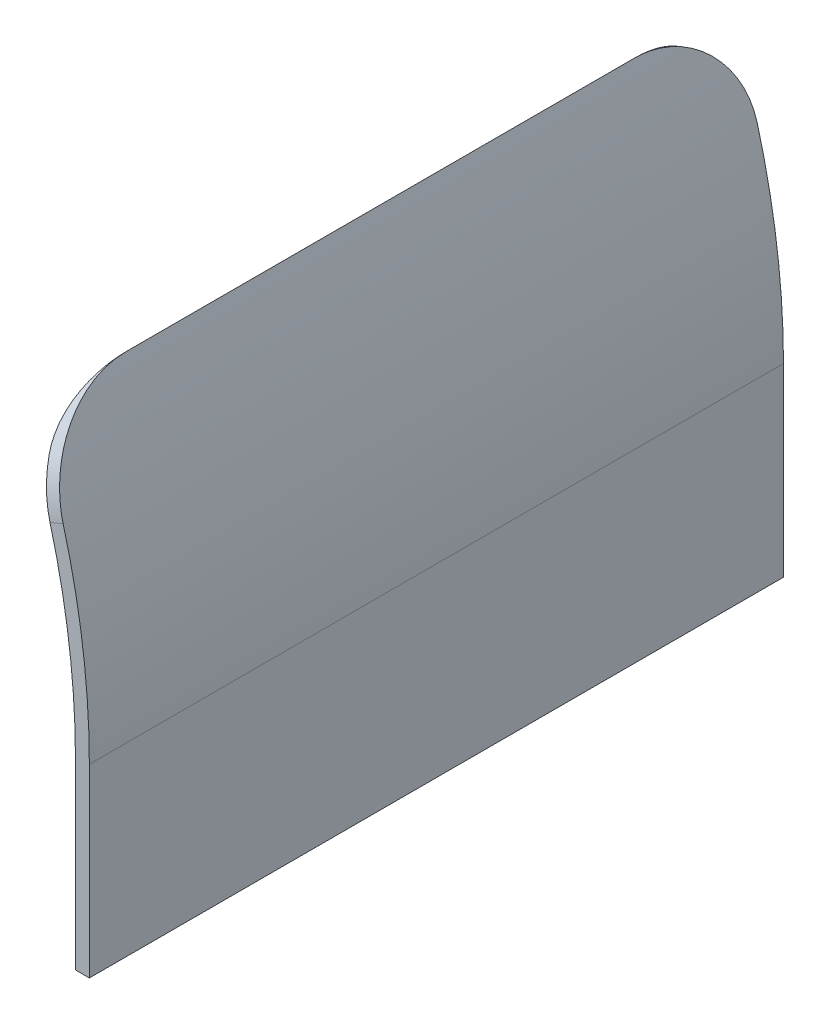
ISO-10303-21;
HEADER;
FILE_DESCRIPTION(('STEP AP214'),'2;1');
FILE_NAME('part.step','',(''),(''),'','','');
FILE_SCHEMA(('AUTOMOTIVE_DESIGN { 1 0 10303 214 1 1 1 1 }'));
ENDSEC;
DATA;
#1=APPLICATION_CONTEXT('core data for automotive mechanical design processes');
#2=APPLICATION_PROTOCOL_DEFINITION('international standard','automotive_design',2000,#1);
#3=PRODUCT_CONTEXT('',#1,'mechanical');
#4=PRODUCT('Part','Part','',(#3));
#5=PRODUCT_RELATED_PRODUCT_CATEGORY('part','',(#4));
#6=PRODUCT_DEFINITION_FORMATION('','',#4);
#7=PRODUCT_DEFINITION_CONTEXT('part definition',#1,'design');
#8=PRODUCT_DEFINITION('design','',#6,#7);
#9=PRODUCT_DEFINITION_SHAPE('','',#8);
#10=(LENGTH_UNIT() NAMED_UNIT(*) SI_UNIT(.MILLI.,.METRE.));
#11=(NAMED_UNIT(*) PLANE_ANGLE_UNIT() SI_UNIT($,.RADIAN.));
#12=(NAMED_UNIT(*) SI_UNIT($,.STERADIAN.) SOLID_ANGLE_UNIT());
#13=UNCERTAINTY_MEASURE_WITH_UNIT(LENGTH_MEASURE(1.E-05),#10,'distance_accuracy_value','');
#14=(GEOMETRIC_REPRESENTATION_CONTEXT(3) GLOBAL_UNCERTAINTY_ASSIGNED_CONTEXT((#13)) GLOBAL_UNIT_ASSIGNED_CONTEXT((#10,
#11,#12)) REPRESENTATION_CONTEXT('',''));
#15=CARTESIAN_POINT('',(0.,0.,0.));
#16=DIRECTION('',(0.,0.,1.));
#17=DIRECTION('',(1.,0.,0.));
#18=AXIS2_PLACEMENT_3D('',#15,#16,#17);
#19=CARTESIAN_POINT('',(0.,0.,375.));
#20=DIRECTION('',(0.,1.,0.));
#21=DIRECTION('',(0.,0.,1.));
#22=AXIS2_PLACEMENT_3D('',#19,#20,#21);
#23=PLANE('',#22);
#24=DIRECTION('',(1.,0.,0.));
#25=VECTOR('',#24,1.);
#26=CARTESIAN_POINT('',(0.,0.,-375.));
#27=LINE('',#26,#25);
#28=CARTESIAN_POINT('',(0.,0.,-375.));
#29=VERTEX_POINT('',#28);
#30=CARTESIAN_POINT('',(15.,0.,-375.));
#31=VERTEX_POINT('',#30);
#32=EDGE_CURVE('E141',#29,#31,#27,.T.);
#33=ORIENTED_EDGE('',*,*,#32,.T.);
#34=DIRECTION('',(0.,0.,-1.));
#35=VECTOR('',#34,1.);
#36=CARTESIAN_POINT('',(15.,0.,375.));
#37=LINE('',#36,#35);
#38=CARTESIAN_POINT('',(15.,0.,375.));
#39=VERTEX_POINT('',#38);
#40=EDGE_CURVE('E119',#39,#31,#37,.T.);
#41=ORIENTED_EDGE('',*,*,#40,.F.);
#42=DIRECTION('',(1.,0.,0.));
#43=VECTOR('',#42,1.);
#44=CARTESIAN_POINT('',(0.,0.,375.));
#45=LINE('',#44,#43);
#46=CARTESIAN_POINT('',(0.,0.,375.));
#47=VERTEX_POINT('',#46);
#48=EDGE_CURVE('E128',#47,#39,#45,.T.);
#49=ORIENTED_EDGE('',*,*,#48,.F.);
#50=DIRECTION('',(0.,0.,-1.));
#51=VECTOR('',#50,1.);
#52=CARTESIAN_POINT('',(0.,0.,375.));
#53=LINE('',#52,#51);
#54=EDGE_CURVE('E226',#47,#29,#53,.T.);
#55=ORIENTED_EDGE('',*,*,#54,.T.);
#56=EDGE_LOOP('',(#33,#41,#49,#55));
#57=FACE_BOUND('',#56,.T.);
#58=ADVANCED_FACE('F45',(#57),#23,.F.);
#59=CARTESIAN_POINT('',(15.,0.,375.));
#60=DIRECTION('',(-1.,0.,0.));
#61=DIRECTION('',(0.,0.,1.));
#62=AXIS2_PLACEMENT_3D('',#59,#60,#61);
#63=PLANE('',#62);
#64=DIRECTION('',(0.,1.,0.));
#65=VECTOR('',#64,1.);
#66=CARTESIAN_POINT('',(15.,0.,-375.));
#67=LINE('',#66,#65);
#68=CARTESIAN_POINT('',(15.,200.,-375.));
#69=VERTEX_POINT('',#68);
#70=EDGE_CURVE('E232',#31,#69,#67,.T.);
#71=ORIENTED_EDGE('',*,*,#70,.T.);
#72=DIRECTION('',(0.,0.,-1.));
#73=VECTOR('',#72,1.);
#74=CARTESIAN_POINT('',(15.,200.,375.));
#75=LINE('',#74,#73);
#76=CARTESIAN_POINT('',(15.,200.,375.));
#77=VERTEX_POINT('',#76);
#78=EDGE_CURVE('E122',#77,#69,#75,.T.);
#79=ORIENTED_EDGE('',*,*,#78,.F.);
#80=DIRECTION('',(0.,1.,0.));
#81=VECTOR('',#80,1.);
#82=CARTESIAN_POINT('',(15.,0.,375.));
#83=LINE('',#82,#81);
#84=EDGE_CURVE('E115',#39,#77,#83,.T.);
#85=ORIENTED_EDGE('',*,*,#84,.F.);
#86=ORIENTED_EDGE('',*,*,#40,.T.);
#87=EDGE_LOOP('',(#71,#79,#85,#86));
#88=FACE_BOUND('',#87,.T.);
#89=ADVANCED_FACE('F117',(#88),#63,.F.);
#90=CARTESIAN_POINT('',(-785.,200.,375.));
#91=DIRECTION('',(0.,0.,-1.));
#92=DIRECTION('',(-1.,0.,0.));
#93=AXIS2_PLACEMENT_3D('',#90,#91,#92);
#94=CYLINDRICAL_SURFACE('',#93,800.);
#95=CARTESIAN_POINT('',(-785.,200.,-375.));
#96=DIRECTION('',(0.,0.,1.));
#97=DIRECTION('',(1.,0.,0.));
#98=AXIS2_PLACEMENT_3D('',#95,#96,#97);
#99=CIRCLE('',#98,800.);
#100=CARTESIAN_POINT('',(-13.2877173778747,410.855763141891,-375.));
#101=VERTEX_POINT('',#100);
#102=EDGE_CURVE('E235',#69,#101,#99,.T.);
#103=ORIENTED_EDGE('',*,*,#102,.T.);
#104=CARTESIAN_POINT('',(-13.2877173778747,410.855763141891,-375.));
#105=CARTESIAN_POINT('',(-13.6577250364129,412.209991403564,-375.000018910547));
#106=CARTESIAN_POINT('',(-14.0313157060757,413.56324410264,-374.970845063242));
#107=CARTESIAN_POINT('',(-14.7849490421952,416.265435949646,-374.854137478364));
#108=CARTESIAN_POINT('',(-15.1649917394234,417.614375076968,-374.766603462378));
#109=CARTESIAN_POINT('',(-15.9308105996656,420.305561009249,-374.533201458944));
#110=CARTESIAN_POINT('',(-16.3165867482794,421.647807831004,-374.387333617982));
#111=CARTESIAN_POINT('',(-17.0930926189071,424.323252370832,-374.037426181503));
#112=CARTESIAN_POINT('',(-17.483822325785,425.656450116536,-373.833386763692));
#113=CARTESIAN_POINT('',(-18.2691275183212,428.310497015986,-373.367568541861));
#114=CARTESIAN_POINT('',(-18.6637000066751,429.63135443052,-373.1058317553));
#115=CARTESIAN_POINT('',(-19.4561387690343,432.259511085844,-372.524881563681));
#116=CARTESIAN_POINT('',(-19.8540053453659,433.566809056799,-372.205662825961));
#117=CARTESIAN_POINT('',(-20.652038544135,436.165282908035,-371.510291521042));
#118=CARTESIAN_POINT('',(-21.0522048867897,437.456460691258,-371.134145744039));
#119=CARTESIAN_POINT('',(-21.853973866843,440.020723173256,-370.325450196681));
#120=CARTESIAN_POINT('',(-22.2555766350668,441.293806168638,-369.892895154605));
#121=CARTESIAN_POINT('',(-23.0594460667762,443.820324734611,-368.971829629249));
#122=CARTESIAN_POINT('',(-23.4617129870541,445.073747691189,-368.483284768101));
#123=CARTESIAN_POINT('',(-24.2656850583927,447.558087799104,-367.451222516608));
#124=CARTESIAN_POINT('',(-24.6673901531011,448.789002824124,-366.907699963895));
#125=CARTESIAN_POINT('',(-25.4691268265985,451.225989932504,-365.766688615531));
#126=CARTESIAN_POINT('',(-25.8691585336861,452.432063949313,-365.169204039546));
#127=CARTESIAN_POINT('',(-26.666553472084,454.817514327678,-363.921202269231));
#128=CARTESIAN_POINT('',(-27.0639164489499,455.996888168281,-363.270680093706));
#129=CARTESIAN_POINT('',(-27.854720750262,458.326418802984,-361.91801214104));
#130=CARTESIAN_POINT('',(-28.2481633556597,459.476585344162,-361.215883898814));
#131=CARTESIAN_POINT('',(-29.0302076910797,461.746278023337,-359.760971456919));
#132=CARTESIAN_POINT('',(-29.4188089630018,462.865801273601,-359.008182506097));
#133=CARTESIAN_POINT('',(-30.1900106580296,465.072151741258,-357.453379544622));
#134=CARTESIAN_POINT('',(-30.5726114309345,466.158980867974,-356.65136841687));
#135=CARTESIAN_POINT('',(-31.330736110453,468.298208103351,-354.999495475144));
#136=CARTESIAN_POINT('',(-31.7062599772519,469.350606018327,-354.149633392069));
#137=CARTESIAN_POINT('',(-32.4478856676362,471.415760294156,-352.406495968416));
#138=CARTESIAN_POINT('',(-32.8140148363094,472.428637622726,-351.513375568254));
#139=CARTESIAN_POINT('',(-33.5370706269137,474.416808378586,-349.682684379559));
#140=CARTESIAN_POINT('',(-33.8939972539362,475.39210182667,-348.745113615618));
#141=CARTESIAN_POINT('',(-34.5975835521476,477.303535110928,-346.8271738585));
#142=CARTESIAN_POINT('',(-34.9442431644635,478.239674722599,-345.846804619988));
#143=CARTESIAN_POINT('',(-35.6262427362653,480.071289031497,-343.845012830625));
#144=CARTESIAN_POINT('',(-35.9615827571005,480.966763949125,-342.823590502338));
#145=CARTESIAN_POINT('',(-36.6200096905904,482.715870810004,-340.741207982379));
#146=CARTESIAN_POINT('',(-36.9430932030172,483.569491160803,-339.680236978548));
#147=CARTESIAN_POINT('',(-37.5758807059166,485.233199235097,-337.520999980803));
#148=CARTESIAN_POINT('',(-37.8855859308919,486.043290976955,-336.422737444802));
#149=CARTESIAN_POINT('',(-38.4907053685442,487.61881933515,-334.19067742813));
#150=CARTESIAN_POINT('',(-38.7861184350095,488.384252370931,-333.056877109352));
#151=CARTESIAN_POINT('',(-39.3616689478563,489.869131284853,-330.755936474801));
#152=CARTESIAN_POINT('',(-39.6418078052782,490.588581411984,-329.588799253942));
#153=CARTESIAN_POINT('',(-40.1866362067176,491.982215768945,-327.220157790107));
#154=CARTESIAN_POINT('',(-40.4512849449763,492.656281085914,-326.01857419444));
#155=CARTESIAN_POINT('',(-40.9634882268658,493.956046153262,-323.586114290732));
#156=CARTESIAN_POINT('',(-41.2110443532076,494.581750382336,-322.355240709063));
#157=CARTESIAN_POINT('',(-41.6883230524377,495.783990948865,-319.866085730181));
#158=CARTESIAN_POINT('',(-41.9180429041101,496.360519785126,-318.607800188178));
#159=CARTESIAN_POINT('',(-42.3588366618777,497.463367750415,-316.066351517486));
#160=CARTESIAN_POINT('',(-42.5699123033419,497.989691552801,-314.783190717727));
#161=CARTESIAN_POINT('',(-42.9726733950597,498.991200205916,-312.194632490098));
#162=CARTESIAN_POINT('',(-43.1643660432165,499.466404044337,-310.889243528657));
#163=CARTESIAN_POINT('',(-43.5278012978003,500.365133616457,-308.258196684566));
#164=CARTESIAN_POINT('',(-43.699545727717,500.788664073858,-306.932540667106));
#165=CARTESIAN_POINT('',(-44.022511479144,501.583397288082,-304.2633785274));
#166=CARTESIAN_POINT('',(-44.1737359073913,501.954607966472,-302.919875141144));
#167=CARTESIAN_POINT('',(-44.4551782220812,502.644189540433,-300.217322185389));
#168=CARTESIAN_POINT('',(-44.5853973780436,502.962563629384,-298.858273560734));
#169=CARTESIAN_POINT('',(-44.8662171724185,503.648094836885,-295.649051381414));
#170=CARTESIAN_POINT('',(-45.0080135537683,503.993359799862,-293.793376080484));
#171=CARTESIAN_POINT('',(-45.2516518399048,504.585757603332,-290.064310802836));
#172=CARTESIAN_POINT('',(-45.3535019133158,504.832910506894,-288.190924528163));
#173=CARTESIAN_POINT('',(-45.5165637901925,505.228264677415,-284.434417668778));
#174=CARTESIAN_POINT('',(-45.5778303007431,505.376599154234,-282.551313651008));
#175=CARTESIAN_POINT('',(-45.6391370625472,505.524985511469,-279.722134206108));
#176=CARTESIAN_POINT('',(-45.6544738205396,505.562095075348,-278.778175618525));
#177=CARTESIAN_POINT('',(-45.6749271062528,505.6115786349,-276.889495550157));
#178=CARTESIAN_POINT('',(-45.6800435893792,505.623952522644,-275.944774066062));
#179=CARTESIAN_POINT('',(-45.6800427553632,505.623953282115,-275.));
#180=B_SPLINE_CURVE_WITH_KNOTS('',3,(#104,#105,#106,#107,#108,#109,#110,#111,#112,#113,#114,
#115,#116,#117,#118,#119,#120,#121,#122,#123,#124,#125,#126,#127,#128,#129,#130,#131,#132,#133,
#134,#135,#136,#137,#138,#139,#140,#141,#142,#143,#144,#145,#146,#147,#148,#149,#150,#151,#152,
#153,#154,#155,#156,#157,#158,#159,#160,#161,#162,#163,#164,#165,#166,#167,#168,#169,#170,#171,
#172,#173,#174,#175,#176,#177,#178,#179),.UNSPECIFIED.,.F.,.F.,(4,2,2,2,2,2,2,2,2,2,2,2,2,2,2,2,
2,2,2,2,2,2,2,2,2,2,2,2,2,2,2,2,2,2,2,2,2,4),(0.,4.21129501087643,8.42261011229035,
12.6339146383732,16.8452062995758,21.0534412072571,25.2620667187199,29.4701906248927,
33.6787080829309,37.8898235652793,42.1013348363465,46.3125170648926,50.5240952567557,
54.7342489791156,58.9447980974444,63.1551008423969,67.3654272674023,71.5616518059008,
75.7578740227314,79.9541202968626,84.1503438247508,88.3477230896977,92.5447142037582,
96.7420413547272,100.938980094841,105.146518639281,109.353667057688,113.561456089396,
117.768853054156,121.974681813024,126.180125809172,130.384932387199,134.589484739198,
140.26479417052,145.938942451439,151.605426268342,154.439536132392,157.273658362556),.UNSPECIFIED.);
#181=CARTESIAN_POINT('',(-45.6800427553632,505.623953282115,-275.));
#182=VERTEX_POINT('',#181);
#183=EDGE_CURVE('E189',#101,#182,#180,.T.);
#184=ORIENTED_EDGE('',*,*,#183,.T.);
#185=DIRECTION('',(0.,0.,-1.));
#186=VECTOR('',#185,1.);
#187=CARTESIAN_POINT('',(-45.6800427553632,505.623953282115,375.));
#188=LINE('',#187,#186);
#189=CARTESIAN_POINT('',(-45.6800427553632,505.623953282115,275.));
#190=VERTEX_POINT('',#189);
#191=EDGE_CURVE('E149',#190,#182,#188,.T.);
#192=ORIENTED_EDGE('',*,*,#191,.F.);
#193=CARTESIAN_POINT('',(-45.6800427553632,505.623953282115,275.));
#194=CARTESIAN_POINT('',(-45.6800565541126,505.623968136574,276.406191723882));
#195=CARTESIAN_POINT('',(-45.6687116734357,505.596542171494,277.812382063271));
#196=CARTESIAN_POINT('',(-45.6234037466712,505.486915370362,280.622257287123));
#197=CARTESIAN_POINT('',(-45.5894407637724,505.404714687336,282.025942178576));
#198=CARTESIAN_POINT('',(-45.4989979226887,505.185650298247,284.828246709429));
#199=CARTESIAN_POINT('',(-45.4425191090568,505.04878912799,286.226866580769));
#200=CARTESIAN_POINT('',(-45.3072405788958,504.720615267442,289.016617183136));
#201=CARTESIAN_POINT('',(-45.2284408831475,504.529302627845,290.407747921134));
#202=CARTESIAN_POINT('',(-45.0488566423127,504.092684965104,293.17895968944));
#203=CARTESIAN_POINT('',(-44.9480893772322,503.847422378406,294.559048525826));
#204=CARTESIAN_POINT('',(-44.7248638370595,503.303164012407,297.306955847708));
#205=CARTESIAN_POINT('',(-44.6024035376501,503.00416321841,298.674773175543));
#206=CARTESIAN_POINT('',(-44.3362240604119,502.352930719918,301.395433195122));
#207=CARTESIAN_POINT('',(-44.1925071256558,502.000704631853,302.748277450704));
#208=CARTESIAN_POINT('',(-43.8842718630225,501.243497186474,305.436860691937));
#209=CARTESIAN_POINT('',(-43.719751590567,500.838510897329,306.772598065662));
#210=CARTESIAN_POINT('',(-43.3704003826977,499.976254754565,309.424986880827));
#211=CARTESIAN_POINT('',(-43.1855614834199,499.518964397558,310.741630608025));
#212=CARTESIAN_POINT('',(-42.796221855903,498.552881302659,313.35307556464));
#213=CARTESIAN_POINT('',(-42.5917192886936,498.044083747515,314.647874737791));
#214=CARTESIAN_POINT('',(-42.1637608101866,496.975845417642,317.213093748428));
#215=CARTESIAN_POINT('',(-41.9403064743756,496.416408852345,318.483515601689));
#216=CARTESIAN_POINT('',(-41.4751424445394,495.247661788293,320.997947167346));
#217=CARTESIAN_POINT('',(-41.2334310452227,494.638346630208,322.24195439856));
#218=CARTESIAN_POINT('',(-40.7326268193662,493.370996027709,324.700893874265));
#219=CARTESIAN_POINT('',(-40.4735385986909,492.712973488817,325.915833708372));
#220=CARTESIAN_POINT('',(-39.9387387174717,491.349023588189,328.314926339061));
#221=CARTESIAN_POINT('',(-39.6630255099536,490.643091767668,329.499076255888));
#222=CARTESIAN_POINT('',(-39.0959002503427,489.184519251853,331.834296450633));
#223=CARTESIAN_POINT('',(-38.8044890626513,488.431881128072,332.985368544624));
#224=CARTESIAN_POINT('',(-38.2068822167709,486.881037648357,335.252454333706));
#225=CARTESIAN_POINT('',(-37.9006864780317,486.082832044155,336.368467837736));
#226=CARTESIAN_POINT('',(-37.2746446325914,484.442548004809,338.562862819675));
#227=CARTESIAN_POINT('',(-36.9548057646562,483.600492784273,339.641263715291));
#228=CARTESIAN_POINT('',(-36.3023289802627,481.873463563861,341.759124036995));
#229=CARTESIAN_POINT('',(-35.9696910659202,480.98848957108,342.798583469519));
#230=CARTESIAN_POINT('',(-35.2926436352677,479.177031158951,344.836714810108));
#231=CARTESIAN_POINT('',(-34.9482340205645,478.250546392616,345.835386377095));
#232=CARTESIAN_POINT('',(-34.2487029097248,476.357572805596,347.790144790076));
#233=CARTESIAN_POINT('',(-33.8935814784842,475.391084227255,348.746231893973));
#234=CARTESIAN_POINT('',(-33.1736301014543,473.419478257059,350.614302332748));
#235=CARTESIAN_POINT('',(-32.808798298854,472.41435346065,351.526277137196));
#236=CARTESIAN_POINT('',(-32.0706166473373,470.367393144097,353.30421659345));
#237=CARTESIAN_POINT('',(-31.6972676016474,469.32556108066,354.170185558448));
#238=CARTESIAN_POINT('',(-30.9430889152035,467.206735429492,355.854729595181));
#239=CARTESIAN_POINT('',(-30.5622586988088,466.129739131783,356.673301000616));
#240=CARTESIAN_POINT('',(-29.7942865454567,463.942557364827,358.261449464839));
#241=CARTESIAN_POINT('',(-29.4071452090701,462.8323750453,359.03103115173));
#242=CARTESIAN_POINT('',(-28.6286101941622,460.583447289337,360.51803202393));
#243=CARTESIAN_POINT('',(-28.2372298185475,459.444781589188,361.235578770137));
#244=CARTESIAN_POINT('',(-27.4503800131302,457.138207854641,362.619336102565));
#245=CARTESIAN_POINT('',(-27.0549109724903,455.970302588516,363.285551524441));
#246=CARTESIAN_POINT('',(-26.2608673046273,453.60694531105,364.56565990955));
#247=CARTESIAN_POINT('',(-25.8622922194976,452.411489185173,365.179544992423));
#248=CARTESIAN_POINT('',(-25.0631972835159,449.995349500728,366.353768895549));
#249=CARTESIAN_POINT('',(-24.6626776180342,448.774668312011,366.914112718343));
#250=CARTESIAN_POINT('',(-23.8608281308054,446.310453097825,367.98019655822));
#251=CARTESIAN_POINT('',(-23.4594986072885,445.066926465181,368.485953887663));
#252=CARTESIAN_POINT('',(-22.656958706531,442.558901737374,369.442178324547));
#253=CARTESIAN_POINT('',(-22.2557483217298,441.294405580245,369.892650509551));
#254=CARTESIAN_POINT('',(-21.4544576967176,438.746701813586,370.737556925593));
#255=CARTESIAN_POINT('',(-21.0543772919095,437.463497116934,371.131999779674));
#256=CARTESIAN_POINT('',(-20.2562761088273,434.88053173691,371.86427172738));
#257=CARTESIAN_POINT('',(-19.8582552055937,433.580772074967,372.202104295788));
#258=CARTESIAN_POINT('',(-18.9308858860504,430.524300674351,372.925385386806));
#259=CARTESIAN_POINT('',(-18.4026893500461,428.76184038977,373.288242146161));
#260=CARTESIAN_POINT('',(-17.3537961308515,425.217055767186,373.91061561424));
#261=CARTESIAN_POINT('',(-16.8330979433524,423.434735544398,374.170153337105));
#262=CARTESIAN_POINT('',(-15.8017365438328,419.857885506434,374.585125350851));
#263=CARTESIAN_POINT('',(-15.2910597047027,418.063377492564,374.740712123541));
#264=CARTESIAN_POINT('',(-14.5333480070523,415.364835181181,374.896293590036));
#265=CARTESIAN_POINT('',(-14.2821254166676,414.464059461957,374.935187626041));
#266=CARTESIAN_POINT('',(-13.7826499346412,412.660937450646,374.987040678364));
#267=CARTESIAN_POINT('',(-13.5343970489941,411.758591155393,374.999999642339));
#268=CARTESIAN_POINT('',(-13.2877173778748,410.855763141891,375.));
#269=B_SPLINE_CURVE_WITH_KNOTS('',3,(#193,#194,#195,#196,#197,#198,#199,#200,#201,#202,#203,
#204,#205,#206,#207,#208,#209,#210,#211,#212,#213,#214,#215,#216,#217,#218,#219,#220,#221,#222,
#223,#224,#225,#226,#227,#228,#229,#230,#231,#232,#233,#234,#235,#236,#237,#238,#239,#240,#241,
#242,#243,#244,#245,#246,#247,#248,#249,#250,#251,#252,#253,#254,#255,#256,#257,#258,#259,#260,
#261,#262,#263,#264,#265,#266,#267,#268),.UNSPECIFIED.,.F.,.F.,(4,2,2,2,2,2,2,2,2,2,2,2,2,2,2,2,
2,2,2,2,2,2,2,2,2,2,2,2,2,2,2,2,2,2,2,2,2,4),(0.,4.21826002803209,8.43650827143591,
12.654560844884,16.8726094913362,21.0873520558621,25.30248813263,29.5171797307678,
33.7322655860591,37.9490094704454,42.1661480941563,46.3829364843149,50.6001192296471,
54.8161885613488,59.0326508103981,63.2488811189141,67.4651344011647,71.6791777936155,
75.8932204894601,80.1072984168306,84.3213508189953,88.5362149023579,92.7506831289345,
96.9654769190217,101.179871940857,105.383559501479,109.586850569131,113.790773490943,
117.994303241226,122.196495880565,126.398302287858,130.599461325182,134.800362397616,
140.423271914824,146.045037198864,151.658537911287,154.466105454338,157.27367866377),.UNSPECIFIED.);
#270=CARTESIAN_POINT('',(-13.2877173778747,410.855763141891,375.));
#271=VERTEX_POINT('',#270);
#272=EDGE_CURVE('E183',#190,#271,#269,.T.);
#273=ORIENTED_EDGE('',*,*,#272,.T.);
#274=CARTESIAN_POINT('',(-785.,200.,375.));
#275=DIRECTION('',(0.,0.,1.));
#276=DIRECTION('',(1.,0.,0.));
#277=AXIS2_PLACEMENT_3D('',#274,#275,#276);
#278=CIRCLE('',#277,800.);
#279=EDGE_CURVE('E127',#77,#271,#278,.T.);
#280=ORIENTED_EDGE('',*,*,#279,.F.);
#281=ORIENTED_EDGE('',*,*,#78,.T.);
#282=EDGE_LOOP('',(#103,#184,#192,#273,#280,#281));
#283=FACE_BOUND('',#282,.T.);
#284=ADVANCED_FACE('F172',(#283),#94,.T.);
#285=CARTESIAN_POINT('',(-800.,197.036521770616,375.));
#286=DIRECTION('',(0.,0.,-1.));
#287=DIRECTION('',(-1.,0.,0.));
#288=AXIS2_PLACEMENT_3D('',#285,#286,#287);
#289=CYLINDRICAL_SURFACE('',#288,800.);
#290=CARTESIAN_POINT('',(-27.5291433547764,405.096070058586,375.));
#291=CARTESIAN_POINT('',(-27.8944080499808,406.452238113832,375.000018864326));
#292=CARTESIAN_POINT('',(-28.2632625196973,407.807442886582,374.970844222511));
#293=CARTESIAN_POINT('',(-29.0074457271469,410.513561600564,374.854129730451));
#294=CARTESIAN_POINT('',(-29.3827744977664,411.86447551996,374.766589583651));
#295=CARTESIAN_POINT('',(-30.1391973411387,414.559634578344,374.533165872968));
#296=CARTESIAN_POINT('',(-30.5202914145217,415.903879716604,374.387282302707));
#297=CARTESIAN_POINT('',(-31.2874723879068,418.583337644585,374.037329945425));
#298=CARTESIAN_POINT('',(-31.6735592722719,419.918550462574,373.833261340592));
#299=CARTESIAN_POINT('',(-32.4496367206329,422.576663487066,373.367362969953));
#300=CARTESIAN_POINT('',(-32.8396243292035,423.899571737127,373.10557417641));
#301=CARTESIAN_POINT('',(-33.6229482746934,426.531838414553,372.5244963289));
#302=CARTESIAN_POINT('',(-34.0162849189537,427.841195573365,372.205201942258));
#303=CARTESIAN_POINT('',(-34.8053214821172,430.443789839257,371.509652047639));
#304=CARTESIAN_POINT('',(-35.2010211122097,431.737028859017,371.133403369234));
#305=CARTESIAN_POINT('',(-35.9939263980552,434.305411446323,370.324470924192));
#306=CARTESIAN_POINT('',(-36.3911321911759,435.580553310467,369.891781883636));
#307=CARTESIAN_POINT('',(-37.1862875265758,438.111199629397,368.970407478489));
#308=CARTESIAN_POINT('',(-37.5842373800425,439.36669118233,368.481686944835));
#309=CARTESIAN_POINT('',(-38.3796585941867,441.855152650938,367.449234399811));
#310=CARTESIAN_POINT('',(-38.7771299063686,443.088120438438,366.905497221568));
#311=CARTESIAN_POINT('',(-39.5704892851061,445.529190059509,365.764015113545));
#312=CARTESIAN_POINT('',(-39.9663774725522,446.737293822131,365.16627439312));
#313=CARTESIAN_POINT('',(-40.7555806268171,449.126773352053,363.917716946776));
#314=CARTESIAN_POINT('',(-41.1488953481018,450.308146594687,363.26689523393));
#315=CARTESIAN_POINT('',(-41.9317028342381,452.641628964536,361.913588348547));
#316=CARTESIAN_POINT('',(-42.3211968718061,453.793748054915,361.211121091396));
#317=CARTESIAN_POINT('',(-43.0954499601692,456.0673006845,359.755485731095));
#318=CARTESIAN_POINT('',(-43.4802085625001,457.188731329508,359.002312868967));
#319=CARTESIAN_POINT('',(-44.2438360991337,459.398843019743,357.446697293732));
#320=CARTESIAN_POINT('',(-44.6227053784893,460.487525987163,356.644257480892));
#321=CARTESIAN_POINT('',(-45.3734826418425,462.630400155604,354.9914825215));
#322=CARTESIAN_POINT('',(-45.7453905870614,463.684591164508,354.141147108245));
#323=CARTESIAN_POINT('',(-46.4797892237149,465.752899851111,352.397322518011));
#324=CARTESIAN_POINT('',(-46.8423096308784,466.76715119063,351.504004378964));
#325=CARTESIAN_POINT('',(-47.5582776104594,468.758021629609,349.672906029109));
#326=CARTESIAN_POINT('',(-47.911725188495,469.734640752372,348.735125845833));
#327=CARTESIAN_POINT('',(-48.6084879191436,471.648671654857,346.816755872696));
#328=CARTESIAN_POINT('',(-48.9518030150475,472.586083215156,345.836165843314));
#329=CARTESIAN_POINT('',(-49.6272528302337,474.420182744078,343.833921551857));
#330=CARTESIAN_POINT('',(-49.9593876102622,475.316870933973,342.812267512962));
#331=CARTESIAN_POINT('',(-50.6115472044263,477.068341991785,340.729410545467));
#332=CARTESIAN_POINT('',(-50.931568647167,477.923113212614,339.668196767329));
#333=CARTESIAN_POINT('',(-51.5583803180836,479.589054857527,337.508465346835));
#334=CARTESIAN_POINT('',(-51.8651717677338,480.400229308443,336.409951165093));
#335=CARTESIAN_POINT('',(-52.4646155224985,481.977850998155,334.177380348448));
#336=CARTESIAN_POINT('',(-52.7572666943193,482.744294652954,333.043320876684));
#337=CARTESIAN_POINT('',(-53.3274497125886,484.231118796949,330.741856031252));
#338=CARTESIAN_POINT('',(-53.6049829565901,484.951503545061,329.574453755167));
#339=CARTESIAN_POINT('',(-54.1446901551494,486.346766320318,327.205555427822));
#340=CARTESIAN_POINT('',(-54.4068274730387,487.021536334405,326.003987409127));
#341=CARTESIAN_POINT('',(-54.9141804697008,488.322651027979,323.571569438831));
#342=CARTESIAN_POINT('',(-55.1593977158377,488.949000193504,322.340722213705));
#343=CARTESIAN_POINT('',(-55.6321745710926,490.152469006203,319.851631118287));
#344=CARTESIAN_POINT('',(-55.8597314880372,490.72958114892,318.593383108261));
#345=CARTESIAN_POINT('',(-56.2963796799783,491.833532372526,316.052020682651));
#346=CARTESIAN_POINT('',(-56.5054726731874,492.360376131649,314.768908594445));
#347=CARTESIAN_POINT('',(-56.9044526499678,493.362859560579,312.180459778563));
#348=CARTESIAN_POINT('',(-57.0943467731427,493.838518269157,310.875131525101));
#349=CARTESIAN_POINT('',(-57.4543718511377,494.738091837689,308.244217412527));
#350=CARTESIAN_POINT('',(-57.6245046121883,495.162011426889,306.918633417385));
#351=CARTESIAN_POINT('',(-57.9444368796891,495.95745621966,304.24962669513));
#352=CARTESIAN_POINT('',(-58.0942394664281,496.3289893608,302.906206704343));
#353=CARTESIAN_POINT('',(-58.3730304603566,497.019148608302,300.203831481335));
#354=CARTESIAN_POINT('',(-58.5020201264416,497.337777914654,298.844877194055));
#355=CARTESIAN_POINT('',(-58.7801002816492,498.023634127939,295.636802151434));
#356=CARTESIAN_POINT('',(-58.9204856005801,498.368989148268,293.782196171514));
#357=CARTESIAN_POINT('',(-59.1617011092964,498.961540590617,290.055302231313));
#358=CARTESIAN_POINT('',(-59.2625393902284,499.208757091465,288.18301796829));
#359=CARTESIAN_POINT('',(-59.4239817694667,499.604211876589,284.428741634823));
#360=CARTESIAN_POINT('',(-59.4846401478106,499.752583694186,282.546766136735));
#361=CARTESIAN_POINT('',(-59.5453384769164,499.901007371348,279.719287581505));
#362=CARTESIAN_POINT('',(-59.5605230515783,499.938126259991,278.775897452482));
#363=CARTESIAN_POINT('',(-59.5807733972704,499.987622249043,276.888355712428));
#364=CARTESIAN_POINT('',(-59.5858391242069,499.999999241636,275.944204098098));
#365=CARTESIAN_POINT('',(-59.5858382910593,500.,275.));
#366=B_SPLINE_CURVE_WITH_KNOTS('',3,(#290,#291,#292,#293,#294,#295,#296,#297,#298,#299,#300,
#301,#302,#303,#304,#305,#306,#307,#308,#309,#310,#311,#312,#313,#314,#315,#316,#317,#318,#319,
#320,#321,#322,#323,#324,#325,#326,#327,#328,#329,#330,#331,#332,#333,#334,#335,#336,#337,#338,
#339,#340,#341,#342,#343,#344,#345,#346,#347,#348,#349,#350,#351,#352,#353,#354,#355,#356,#357,
#358,#359,#360,#361,#362,#363,#364,#365),.UNSPECIFIED.,.F.,.F.,(4,2,2,2,2,2,2,2,2,2,2,2,2,2,2,2,
2,2,2,2,2,2,2,2,2,2,2,2,2,2,2,2,2,2,2,2,2,4),(0.,4.21318640938884,8.42639422615339,
12.6396025035198,16.8527975886159,21.063011541022,25.2736161210304,29.4837161933075,
33.6942099494016,37.9073611089245,42.1209083133454,46.3341273719234,50.5477427168583,
54.7599032303009,58.9724596289394,63.1847682783775,67.3971003860176,71.5938700459787,
75.7906371071508,79.9874276522001,84.1841953911213,88.3821227159389,92.5796616288605,
96.7775364037008,100.975022451782,105.182122884141,109.388833073722,113.5961832875,
117.803141560896,122.008529567135,126.213532888965,130.417898384489,134.622009478263,
140.293913505966,145.964656481417,151.627722998897,154.460123354176,157.292536051877),.UNSPECIFIED.);
#367=CARTESIAN_POINT('',(-27.5291433547764,405.096070058586,375.));
#368=VERTEX_POINT('',#367);
#369=CARTESIAN_POINT('',(-42.3413588034726,453.850429922475,361.164336657928));
#370=VERTEX_POINT('',#369);
#371=EDGE_CURVE('E143',#368,#370,#366,.T.);
#372=ORIENTED_EDGE('',*,*,#371,.T.);
#373=DIRECTION('',(0.,0.,-1.));
#374=VECTOR('',#373,1.);
#375=CARTESIAN_POINT('',(-42.3413588034725,453.850429922475,375.));
#376=LINE('',#375,#374);
#377=CARTESIAN_POINT('',(-42.3413588034726,453.850429922475,-361.164336657928));
#378=VERTEX_POINT('',#377);
#379=EDGE_CURVE('E211',#370,#378,#376,.T.);
#380=ORIENTED_EDGE('',*,*,#379,.T.);
#381=CARTESIAN_POINT('',(-59.5858382910594,500.,-275.));
#382=CARTESIAN_POINT('',(-59.5858520234534,500.000014875716,-276.406144996598));
#383=CARTESIAN_POINT('',(-59.5746068324503,499.972550724524,-277.812288617039));
#384=CARTESIAN_POINT('',(-59.5296973187888,499.862771286295,-280.622070792378));
#385=CARTESIAN_POINT('',(-59.4960330581189,499.78045615092,-282.025709354191));
#386=CARTESIAN_POINT('',(-59.4063861790104,499.561086701523,-284.827922517796));
#387=CARTESIAN_POINT('',(-59.3504045862108,499.424034903037,-286.22649734932));
#388=CARTESIAN_POINT('',(-59.2163180755653,499.095403941317,-289.01615880955));
#389=CARTESIAN_POINT('',(-59.1382131784179,498.903824829099,-290.407245445259));
#390=CARTESIAN_POINT('',(-58.9602138338822,498.46659810038,-293.178376235066));
#391=CARTESIAN_POINT('',(-58.8603364173378,498.220992742791,-294.558428150891));
#392=CARTESIAN_POINT('',(-58.6390848683711,497.675973646142,-297.306262735933));
#393=CARTESIAN_POINT('',(-58.5177087299146,497.376554885742,-298.674044247681));
#394=CARTESIAN_POINT('',(-58.2538897629313,496.724412143301,-301.394633606422));
#395=CARTESIAN_POINT('',(-58.1114491589281,496.371693789906,-302.747443018357));
#396=CARTESIAN_POINT('',(-57.8059567047754,495.613428389717,-305.435957492767));
#397=CARTESIAN_POINT('',(-57.6429029279005,495.207876404424,-306.771660943469));
#398=CARTESIAN_POINT('',(-57.2966724349513,494.344415454117,-309.423985641814));
#399=CARTESIAN_POINT('',(-57.1134877822093,493.886485836115,-310.740599129939));
#400=CARTESIAN_POINT('',(-56.7276415585171,492.919053153741,-313.351983791308));
#401=CARTESIAN_POINT('',(-56.5249781658669,492.409545265405,-314.646752908276));
#402=CARTESIAN_POINT('',(-56.1008795733134,491.339817059196,-317.211911537639));
#403=CARTESIAN_POINT('',(-55.879445933458,490.779600955563,-318.482303065382));
#404=CARTESIAN_POINT('',(-55.4185018357711,489.609227537679,-320.996673139608));
#405=CARTESIAN_POINT('',(-55.1789896892414,488.999065557575,-322.240649204704));
#406=CARTESIAN_POINT('',(-54.6827586057969,487.729957791407,-324.699522824691));
#407=CARTESIAN_POINT('',(-54.4260442581051,487.071025011608,-325.914428018692));
#408=CARTESIAN_POINT('',(-53.8961633469156,485.705192596988,-328.313449474604));
#409=CARTESIAN_POINT('',(-53.6229952521591,484.998288496965,-329.497562856165));
#410=CARTESIAN_POINT('',(-53.0611271195098,483.537712617092,-331.832707460916));
#411=CARTESIAN_POINT('',(-52.7724279378,482.784043414914,-332.983740502373));
#412=CARTESIAN_POINT('',(-52.1804079189227,481.231082260238,-335.250745285113));
#413=CARTESIAN_POINT('',(-51.8770870022177,480.431790059561,-336.366716835619));
#414=CARTESIAN_POINT('',(-51.2569728659551,478.789337857416,-338.560949570932));
#415=CARTESIAN_POINT('',(-50.9401877365024,477.946204132373,-339.639232710736));
#416=CARTESIAN_POINT('',(-50.2939736730346,476.216975971025,-341.75685962869));
#417=CARTESIAN_POINT('',(-49.9645447412489,475.330881542294,-342.796203413706));
#418=CARTESIAN_POINT('',(-49.2940655091126,473.517144394867,-344.834105951566));
#419=CARTESIAN_POINT('',(-48.9530151126037,472.589501332368,-345.832664366795));
#420=CARTESIAN_POINT('',(-48.2603472946256,470.694177459693,-347.787199797442));
#421=CARTESIAN_POINT('',(-47.9087299370607,469.726496891633,-348.743177070284));
#422=CARTESIAN_POINT('',(-47.1959272731756,467.75247894333,-350.61103072942));
#423=CARTESIAN_POINT('',(-46.8347401513631,466.746134211524,-351.522898653602));
#424=CARTESIAN_POINT('',(-46.1039811126777,464.696709499716,-353.30063019795));
#425=CARTESIAN_POINT('',(-45.7344099863066,463.653632977962,-354.166498129799));
#426=CARTESIAN_POINT('',(-44.9879149327641,461.532298283393,-355.850847644592));
#427=CARTESIAN_POINT('',(-44.6109904396137,460.454037398154,-356.669325560599));
#428=CARTESIAN_POINT('',(-43.8509505147847,458.264311141297,-358.257296701005));
#429=CARTESIAN_POINT('',(-43.4678356719623,457.152848919514,-359.026794550629));
#430=CARTESIAN_POINT('',(-42.6974509449891,454.901333820484,-360.513653197571));
#431=CARTESIAN_POINT('',(-42.3101939826834,453.76136015221,-361.231140637994));
#432=CARTESIAN_POINT('',(-41.5316975038641,451.452163089984,-362.614792394591));
#433=CARTESIAN_POINT('',(-41.1404583661984,450.282942463324,-363.280961542253));
#434=CARTESIAN_POINT('',(-40.3549750365899,447.916951407718,-364.560993273075));
#435=CARTESIAN_POINT('',(-39.9607304026379,446.720176872101,-365.174847994281));
#436=CARTESIAN_POINT('',(-39.1703882995728,444.301401127207,-366.34903079581));
#437=CARTESIAN_POINT('',(-38.7742910070471,443.079402285774,-366.909363872757));
#438=CARTESIAN_POINT('',(-37.9813669875627,440.612548722021,-367.975452857449));
#439=CARTESIAN_POINT('',(-37.5845405265733,439.367701245533,-368.481225729183));
#440=CARTESIAN_POINT('',(-36.7910828594148,436.857041951647,-369.437507838618));
#441=CARTESIAN_POINT('',(-36.3944516386646,435.591232069404,-369.888022145613));
#442=CARTESIAN_POINT('',(-35.6023866759339,433.040909877453,-370.733043736866));
#443=CARTESIAN_POINT('',(-35.2069527596214,431.756400465992,-371.127559600555));
#444=CARTESIAN_POINT('',(-34.4182038504453,429.170837357779,-371.86001239443));
#445=CARTESIAN_POINT('',(-34.024888729462,427.869784677725,-372.197952783659));
#446=CARTESIAN_POINT('',(-33.1079212988986,424.808092015459,-372.922054896763));
#447=CARTESIAN_POINT('',(-32.5854478952954,423.041675654463,-373.28551111494));
#448=CARTESIAN_POINT('',(-31.5480905391603,419.488960350034,-373.908901265978));
#449=CARTESIAN_POINT('',(-31.0332050684609,417.702665512875,-374.168856185428));
#450=CARTESIAN_POINT('',(-30.0135401547899,414.117884728867,-374.584486398719));
#451=CARTESIAN_POINT('',(-29.508746915632,412.319420670537,-374.740315059912));
#452=CARTESIAN_POINT('',(-28.7599056451246,409.614961399451,-374.896136121629));
#453=CARTESIAN_POINT('',(-28.511647931733,408.712216404021,-374.935089482809));
#454=CARTESIAN_POINT('',(-28.018115029671,406.905163329765,-374.987021263877));
#455=CARTESIAN_POINT('',(-27.772839846722,406.000855247944,-374.999999633946));
#456=CARTESIAN_POINT('',(-27.5291433547764,405.096070058586,-375.));
#457=B_SPLINE_CURVE_WITH_KNOTS('',3,(#381,#382,#383,#384,#385,#386,#387,#388,#389,#390,#391,
#392,#393,#394,#395,#396,#397,#398,#399,#400,#401,#402,#403,#404,#405,#406,#407,#408,#409,#410,
#411,#412,#413,#414,#415,#416,#417,#418,#419,#420,#421,#422,#423,#424,#425,#426,#427,#428,#429,
#430,#431,#432,#433,#434,#435,#436,#437,#438,#439,#440,#441,#442,#443,#444,#445,#446,#447,#448,
#449,#450,#451,#452,#453,#454,#455,#456),.UNSPECIFIED.,.F.,.F.,(4,2,2,2,2,2,2,2,2,2,2,2,2,2,2,2,
2,2,2,2,2,2,2,2,2,2,2,2,2,2,2,2,2,2,2,2,2,4),(0.,4.21811990454821,8.43622814610107,
12.6541425581515,16.8720530239343,21.0866759304813,25.3016923086017,29.5162638752011,
33.7312296719437,37.9478632360445,42.1648915345702,46.3815696870725,50.5986422045504,
54.8145941314853,59.0309390216532,63.2470517148811,67.4631873449944,71.6768245237504,
75.8904609595296,80.1041322682396,84.3177780996375,88.5322291132157,92.7462843973395,
96.9606653215527,101.174647686358,105.37799821018,109.580952514169,113.784537339659,
117.987729346494,122.189610696973,126.391106287582,130.591957477383,134.792551731857,
140.422153969592,146.050614130981,151.670765763148,154.481656767966,157.292553164006),.UNSPECIFIED.);
#458=CARTESIAN_POINT('',(-27.5291433547764,405.096070058586,-375.));
#459=VERTEX_POINT('',#458);
#460=EDGE_CURVE('E147',#378,#459,#457,.T.);
#461=ORIENTED_EDGE('',*,*,#460,.T.);
#462=CARTESIAN_POINT('',(-800.,197.036521770616,-375.));
#463=DIRECTION('',(0.,0.,-1.));
#464=DIRECTION('',(1.,0.,0.));
#465=AXIS2_PLACEMENT_3D('',#462,#463,#464);
#466=CIRCLE('',#465,800.);
#467=CARTESIAN_POINT('',(0.,197.036521770616,-375.));
#468=VERTEX_POINT('',#467);
#469=EDGE_CURVE('E239',#459,#468,#466,.T.);
#470=ORIENTED_EDGE('',*,*,#469,.T.);
#471=DIRECTION('',(0.,0.,-1.));
#472=VECTOR('',#471,1.);
#473=CARTESIAN_POINT('',(0.,197.036521770616,375.));
#474=LINE('',#473,#472);
#475=CARTESIAN_POINT('',(0.,197.036521770616,375.));
#476=VERTEX_POINT('',#475);
#477=EDGE_CURVE('E221',#476,#468,#474,.T.);
#478=ORIENTED_EDGE('',*,*,#477,.F.);
#479=CARTESIAN_POINT('',(-800.,197.036521770616,375.));
#480=DIRECTION('',(0.,0.,-1.));
#481=DIRECTION('',(1.,0.,0.));
#482=AXIS2_PLACEMENT_3D('',#479,#480,#481);
#483=CIRCLE('',#482,800.);
#484=EDGE_CURVE('E218',#368,#476,#483,.T.);
#485=ORIENTED_EDGE('',*,*,#484,.F.);
#486=EDGE_LOOP('',(#372,#380,#461,#470,#478,#485));
#487=FACE_BOUND('',#486,.T.);
#488=ADVANCED_FACE('F166',(#487),#289,.F.);
#489=CARTESIAN_POINT('',(0.,0.,375.));
#490=DIRECTION('',(1.,0.,0.));
#491=DIRECTION('',(0.,0.,-1.));
#492=AXIS2_PLACEMENT_3D('',#489,#490,#491);
#493=PLANE('',#492);
#494=DIRECTION('',(0.,-1.,0.));
#495=VECTOR('',#494,1.);
#496=CARTESIAN_POINT('',(0.,0.,-375.));
#497=LINE('',#496,#495);
#498=EDGE_CURVE('E138',#468,#29,#497,.T.);
#499=ORIENTED_EDGE('',*,*,#498,.T.);
#500=ORIENTED_EDGE('',*,*,#54,.F.);
#501=DIRECTION('',(0.,-1.,0.));
#502=VECTOR('',#501,1.);
#503=CARTESIAN_POINT('',(0.,0.,375.));
#504=LINE('',#503,#502);
#505=EDGE_CURVE('E133',#476,#47,#504,.T.);
#506=ORIENTED_EDGE('',*,*,#505,.F.);
#507=ORIENTED_EDGE('',*,*,#477,.T.);
#508=EDGE_LOOP('',(#499,#500,#506,#507));
#509=FACE_BOUND('',#508,.T.);
#510=ADVANCED_FACE('F171',(#509),#493,.F.);
#511=CARTESIAN_POINT('',(-785.,200.,375.));
#512=DIRECTION('',(0.,0.,1.));
#513=DIRECTION('',(1.,0.,0.));
#514=AXIS2_PLACEMENT_3D('',#511,#512,#513);
#515=PLANE('',#514);
#516=ORIENTED_EDGE('',*,*,#279,.T.);
#517=DIRECTION('',(-0.927053035713079,-0.374930218807667,0.));
#518=VECTOR('',#517,1.);
#519=CARTESIAN_POINT('',(-22.0928164102927,407.294696428692,375.));
#520=LINE('',#519,#518);
#521=EDGE_CURVE('E197',#271,#368,#520,.T.);
#522=ORIENTED_EDGE('',*,*,#521,.T.);
#523=ORIENTED_EDGE('',*,*,#484,.T.);
#524=ORIENTED_EDGE('',*,*,#505,.T.);
#525=ORIENTED_EDGE('',*,*,#48,.T.);
#526=ORIENTED_EDGE('',*,*,#84,.T.);
#527=EDGE_LOOP('',(#516,#522,#523,#524,#525,#526));
#528=FACE_BOUND('',#527,.T.);
#529=ADVANCED_FACE('F131',(#528),#515,.T.);
#530=CARTESIAN_POINT('',(-785.,200.,-375.));
#531=DIRECTION('',(0.,0.,1.));
#532=DIRECTION('',(1.,0.,0.));
#533=AXIS2_PLACEMENT_3D('',#530,#531,#532);
#534=PLANE('',#533);
#535=ORIENTED_EDGE('',*,*,#469,.F.);
#536=DIRECTION('',(-0.927053035713079,-0.374930218807667,0.));
#537=VECTOR('',#536,1.);
#538=CARTESIAN_POINT('',(-749.80763255329,112.983298121034,-375.));
#539=LINE('',#538,#537);
#540=EDGE_CURVE('E250',#459,#101,#539,.F.);
#541=ORIENTED_EDGE('',*,*,#540,.T.);
#542=ORIENTED_EDGE('',*,*,#102,.F.);
#543=ORIENTED_EDGE('',*,*,#70,.F.);
#544=ORIENTED_EDGE('',*,*,#32,.F.);
#545=ORIENTED_EDGE('',*,*,#498,.F.);
#546=EDGE_LOOP('',(#535,#541,#542,#543,#544,#545));
#547=FACE_BOUND('',#546,.T.);
#548=ADVANCED_FACE('F202',(#547),#534,.F.);
#549=CARTESIAN_POINT('',(-8.18702087459648,412.918649710807,-275.));
#550=DIRECTION('',(-0.927053035713079,-0.374930218807667,0.));
#551=DIRECTION('',(0.374930218807667,-0.927053035713079,0.));
#552=AXIS2_PLACEMENT_3D('',#549,#550,#551);
#553=CYLINDRICAL_SURFACE('',#552,100.);
#554=ORIENTED_EDGE('',*,*,#460,.F.);
#555=CARTESIAN_POINT('',(-42.3413588034725,453.850429922475,-361.164336657928));
#556=CARTESIAN_POINT('',(-42.719048514973,454.964624042352,-360.472575393907));
#557=CARTESIAN_POINT('',(-43.0725517987985,456.072281375144,-359.757296521064));
#558=CARTESIAN_POINT('',(-43.7333017450818,458.271021694774,-358.281770904404));
#559=CARTESIAN_POINT('',(-44.0405570879415,459.362107757267,-357.521532636543));
#560=CARTESIAN_POINT('',(-44.6107058341185,461.523254349061,-355.958885925443));
#561=CARTESIAN_POINT('',(-44.8736550197319,462.593339795093,-355.156532201983));
#562=CARTESIAN_POINT('',(-45.3580980916441,464.711027148115,-353.510640539039));
#563=CARTESIAN_POINT('',(-45.5795900535241,465.758628009387,-352.66710069001));
#564=CARTESIAN_POINT('',(-45.982482122619,467.822611858794,-350.94570438157));
#565=CARTESIAN_POINT('',(-46.1641074478047,468.839140738494,-350.06807549528));
#566=CARTESIAN_POINT('',(-46.491518475103,470.844895768689,-348.275650311158));
#567=CARTESIAN_POINT('',(-46.6373002083623,471.834118884942,-347.360849910493));
#568=CARTESIAN_POINT('',(-47.024923686096,474.75777442583,-344.562779513166));
#569=CARTESIAN_POINT('',(-47.2170274023465,476.648106862817,-342.625912146661));
#570=CARTESIAN_POINT('',(-47.4898845269086,480.284813028233,-338.631852129847));
#571=CARTESIAN_POINT('',(-47.5711645223727,482.031830218852,-336.57527726869));
#572=CARTESIAN_POINT('',(-47.6463678096482,485.377238270712,-332.343354035472));
#573=CARTESIAN_POINT('',(-47.6402985512014,486.97564179504,-330.168015808127));
#574=CARTESIAN_POINT('',(-47.5631139946766,490.013353027623,-325.701276008406));
#575=CARTESIAN_POINT('',(-47.4918170078043,491.452203750695,-323.409567140616));
#576=CARTESIAN_POINT('',(-47.3065790286112,494.150451528604,-318.723815690518));
#577=CARTESIAN_POINT('',(-47.1926358698331,495.409839462111,-316.329767914791));
#578=CARTESIAN_POINT('',(-47.0008877722845,497.20535592475,-312.556909364796));
#579=CARTESIAN_POINT('',(-46.9301347372138,497.810431762252,-311.210170502541));
#580=CARTESIAN_POINT('',(-46.7861902950893,498.959243186837,-308.490957138771));
#581=CARTESIAN_POINT('',(-46.7129991462302,499.502985242545,-307.11848536904));
#582=CARTESIAN_POINT('',(-46.5676207041736,500.526519653039,-304.349332533636));
#583=CARTESIAN_POINT('',(-46.4954337445565,501.006291191422,-302.952643753858));
#584=CARTESIAN_POINT('',(-46.3553807878265,501.898917413744,-300.137827050832));
#585=CARTESIAN_POINT('',(-46.2875146868503,502.311773706538,-298.719699643932));
#586=CARTESIAN_POINT('',(-46.1593969020109,503.066425011608,-295.870400440309));
#587=CARTESIAN_POINT('',(-46.0991157345179,503.408498734806,-294.439303897258));
#588=CARTESIAN_POINT('',(-45.9885064411825,504.021306269331,-291.561402142264));
#589=CARTESIAN_POINT('',(-45.9381789443185,504.292035572721,-290.114595943709));
#590=CARTESIAN_POINT('',(-45.8497424831479,504.75988543588,-287.210072614121));
#591=CARTESIAN_POINT('',(-45.8116228087858,504.957070541919,-285.752366201477));
#592=CARTESIAN_POINT('',(-45.7492396689173,505.276558514469,-282.828711037643));
#593=CARTESIAN_POINT('',(-45.7249727436292,505.398880079012,-281.36276443692));
#594=CARTESIAN_POINT('',(-45.7034939934586,505.506717792499,-279.487188287449));
#595=CARTESIAN_POINT('',(-45.6994012533714,505.527228677993,-279.079458178565));
#596=CARTESIAN_POINT('',(-45.6923752030681,505.562396098638,-278.263790549615));
#597=CARTESIAN_POINT('',(-45.6894417126403,505.577053543741,-277.855853071667));
#598=CARTESIAN_POINT('',(-45.684745938065,505.600501210123,-277.04000482026));
#599=CARTESIAN_POINT('',(-45.6829830810907,505.609294301019,-276.632094131546));
#600=CARTESIAN_POINT('',(-45.6806310763523,505.621021067359,-275.816122678807));
#601=CARTESIAN_POINT('',(-45.6800421083857,505.623953845214,-275.408061901364));
#602=CARTESIAN_POINT('',(-45.6800427553624,505.623953282115,-275.));
#603=B_SPLINE_CURVE_WITH_KNOTS('',3,(#555,#556,#557,#558,#559,#560,#561,#562,#563,#564,#565,
#566,#567,#568,#569,#570,#571,#572,#573,#574,#575,#576,#577,#578,#579,#580,#581,#582,#583,#584,
#585,#586,#587,#588,#589,#590,#591,#592,#593,#594,#595,#596,#597,#598,#599,#600,#601,#602),
.UNSPECIFIED.,.F.,.F.,(4,2,2,2,2,2,2,2,2,2,2,2,2,2,2,2,2,2,2,2,2,2,2,4),(0.,4.09373530984019,
8.18670129465104,12.2744750160872,16.3624384424185,20.4266768416394,24.4913650593237,
32.6210804933814,40.7120307617918,48.8022909827069,56.9151550844006,65.0284313815648,
69.4615185383825,73.8941377174671,78.3281957964367,82.7621472508211,87.1782927761816,
91.5947172713237,96.0072565069393,100.418693209822,101.643468413729,102.868053144623,
104.092038206347,105.316210724202),.UNSPECIFIED.);
#604=EDGE_CURVE('E59',#378,#182,#603,.T.);
#605=ORIENTED_EDGE('',*,*,#604,.T.);
#606=ORIENTED_EDGE('',*,*,#183,.F.);
#607=ORIENTED_EDGE('',*,*,#540,.F.);
#608=EDGE_LOOP('',(#554,#605,#606,#607));
#609=FACE_BOUND('',#608,.T.);
#610=ADVANCED_FACE('F199',(#609),#553,.T.);
#611=CARTESIAN_POINT('',(-749.80763255329,112.983298121034,275.));
#612=DIRECTION('',(0.927053035713079,0.374930218807667,0.));
#613=DIRECTION('',(-0.374930218807667,0.927053035713079,0.));
#614=AXIS2_PLACEMENT_3D('',#611,#612,#613);
#615=CYLINDRICAL_SURFACE('',#614,100.);
#616=ORIENTED_EDGE('',*,*,#272,.F.);
#617=CARTESIAN_POINT('',(-45.6800427553632,505.623953282115,275.));
#618=CARTESIAN_POINT('',(-45.6800393513262,505.623955521735,275.659177771251));
#619=CARTESIAN_POINT('',(-45.681578447569,505.616301150609,276.318330171206));
#620=CARTESIAN_POINT('',(-45.6877107187727,505.585705683212,277.636258739261));
#621=CARTESIAN_POINT('',(-45.6923038602036,505.562764754772,278.295034911412));
#622=CARTESIAN_POINT('',(-45.7106162607842,505.471060443032,280.270142648319));
#623=CARTESIAN_POINT('',(-45.7288685131946,505.379415518089,281.585443759504));
#624=CARTESIAN_POINT('',(-45.776790932579,505.135846080478,284.208799472001));
#625=CARTESIAN_POINT('',(-45.8064492188633,504.983984285479,285.516860181663));
#626=CARTESIAN_POINT('',(-45.8761284504121,504.620965210069,288.124467162318));
#627=CARTESIAN_POINT('',(-45.9161495304808,504.409807158303,289.424013322324));
#628=CARTESIAN_POINT('',(-46.0047828987182,503.931416408397,292.001714111974));
#629=CARTESIAN_POINT('',(-46.0533242768589,503.664643367833,293.279956675976));
#630=CARTESIAN_POINT('',(-46.1575234012152,503.075556087984,295.823290790716));
#631=CARTESIAN_POINT('',(-46.2131812972296,502.753240679515,297.088382064021));
#632=CARTESIAN_POINT('',(-46.3296901358881,502.05470864684,299.603622156724));
#633=CARTESIAN_POINT('',(-46.3905421017983,501.678481391689,300.853767976208));
#634=CARTESIAN_POINT('',(-46.515284521718,500.874055110714,303.336973482021));
#635=CARTESIAN_POINT('',(-46.5791749782461,500.445856041809,304.570033154186));
#636=CARTESIAN_POINT('',(-46.7714884975,499.089776893355,308.231316841318));
#637=CARTESIAN_POINT('',(-46.9010842343317,498.087427599294,310.632309886031));
#638=CARTESIAN_POINT('',(-47.1441421274285,495.89941509644,315.349378862475));
#639=CARTESIAN_POINT('',(-47.2576047847648,494.713757583338,317.665457429875));
#640=CARTESIAN_POINT('',(-47.4487499246495,492.16941590504,322.212378522399));
#641=CARTESIAN_POINT('',(-47.526310079414,490.8101600283,324.442906228863));
#642=CARTESIAN_POINT('',(-47.6246917671531,487.935849349355,328.802515697023));
#643=CARTESIAN_POINT('',(-47.6455115202642,486.420789661359,330.93159427435));
#644=CARTESIAN_POINT('',(-47.6080835092421,483.071940307604,335.31101768425));
#645=CARTESIAN_POINT('',(-47.5407907534809,481.221441216353,337.548540363912));
#646=CARTESIAN_POINT('',(-47.283172949813,477.362226677581,341.877181563606));
#647=CARTESIAN_POINT('',(-47.0928140843208,475.353467874828,343.968259666731));
#648=CARTESIAN_POINT('',(-46.6951660874121,472.241570109757,346.979375989114));
#649=CARTESIAN_POINT('',(-46.5442860481352,471.189699015031,347.960588714739));
#650=CARTESIAN_POINT('',(-46.2019791557813,469.054609341748,349.880847009854));
#651=CARTESIAN_POINT('',(-46.0105575954795,467.971394871053,350.819898064257));
#652=CARTESIAN_POINT('',(-45.5841301354888,465.777284672137,352.653137233106));
#653=CARTESIAN_POINT('',(-45.3491543769963,464.666408544311,353.547355832914));
#654=CARTESIAN_POINT('',(-44.8325182976922,462.41960011436,355.289319886483));
#655=CARTESIAN_POINT('',(-44.5508680056699,461.283673240157,356.137075271669));
#656=CARTESIAN_POINT('',(-44.1065540314251,459.620867464093,357.331092356461));
#657=CARTESIAN_POINT('',(-43.9636202353175,459.10254047578,357.696789865555));
#658=CARTESIAN_POINT('',(-43.6674956828129,458.061923534526,358.418077246189));
#659=CARTESIAN_POINT('',(-43.5143067526996,457.539634301813,358.773668901444));
#660=CARTESIAN_POINT('',(-43.1974479549226,456.49147279475,359.474526239094));
#661=CARTESIAN_POINT('',(-43.0337800599168,455.965601211335,359.819793847134));
#662=CARTESIAN_POINT('',(-42.6956870118819,454.910452140459,360.499932806536));
#663=CARTESIAN_POINT('',(-42.5212598169668,454.381174023686,360.834802166291));
#664=CARTESIAN_POINT('',(-42.3413588034726,453.850429922475,361.164336657928));
#665=B_SPLINE_CURVE_WITH_KNOTS('',3,(#617,#618,#619,#620,#621,#622,#623,#624,#625,#626,#627,
#628,#629,#630,#631,#632,#633,#634,#635,#636,#637,#638,#639,#640,#641,#642,#643,#644,#645,#646,
#647,#648,#649,#650,#651,#652,#653,#654,#655,#656,#657,#658,#659,#660,#661,#662,#663,#664),
.UNSPECIFIED.,.F.,.F.,(4,2,2,2,2,2,2,2,2,2,2,2,2,2,2,2,2,2,2,2,2,2,2,4),(0.,1.97743660954703,
3.95485150945718,7.9091109099592,11.859262603751,15.8094656855966,19.7282301968085,
23.6470772094263,27.5666980505639,31.4863221407577,39.2924092608445,47.0982538816315,
54.9305024513843,62.7629967045151,71.4660187097317,80.1714332530884,84.5092868469711,
88.8465744742582,93.1808716613594,97.5142387582231,99.4648601991295,101.415135183331,
103.365044102985,105.315324219179),.UNSPECIFIED.);
#666=EDGE_CURVE('E11',#190,#370,#665,.T.);
#667=ORIENTED_EDGE('',*,*,#666,.T.);
#668=ORIENTED_EDGE('',*,*,#371,.F.);
#669=ORIENTED_EDGE('',*,*,#521,.F.);
#670=EDGE_LOOP('',(#616,#667,#668,#669));
#671=FACE_BOUND('',#670,.T.);
#672=ADVANCED_FACE('F164',(#671),#615,.T.);
#673=CARTESIAN_POINT('',(52.3659713460934,485.952168441458,375.));
#674=DIRECTION('',(0.,0.,-1.));
#675=DIRECTION('',(-1.,0.,0.));
#676=AXIS2_PLACEMENT_3D('',#673,#674,#675);
#677=CYLINDRICAL_SURFACE('',#676,100.);
#678=ORIENTED_EDGE('',*,*,#666,.F.);
#679=ORIENTED_EDGE('',*,*,#191,.T.);
#680=ORIENTED_EDGE('',*,*,#604,.F.);
#681=ORIENTED_EDGE('',*,*,#379,.F.);
#682=EDGE_LOOP('',(#678,#679,#680,#681));
#683=FACE_BOUND('',#682,.T.);
#684=ADVANCED_FACE('F47',(#683),#677,.T.);
#685=CLOSED_SHELL('',(#58,#89,#284,#488,#510,#529,#548,#610,#672,#684));
#686=MANIFOLD_SOLID_BREP('B2',#685);
#687=ADVANCED_BREP_SHAPE_REPRESENTATION('',(#18,#686),#14);
#688=SHAPE_DEFINITION_REPRESENTATION(#9,#687);
ENDSEC;
END-ISO-10303-21;
